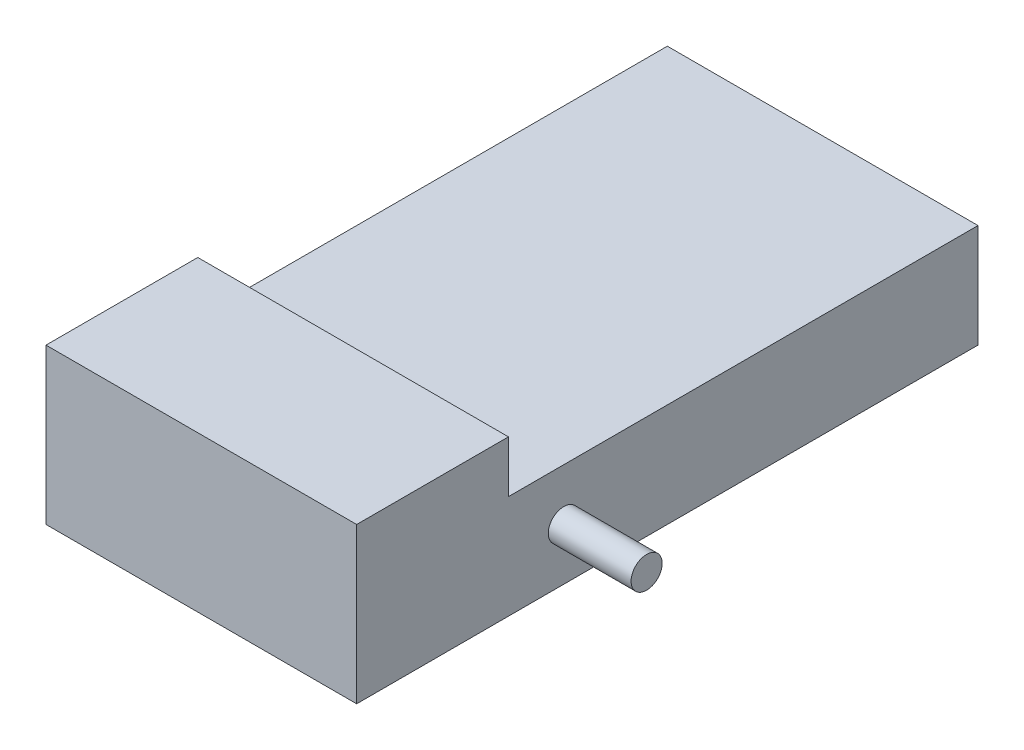
ISO-10303-21;
HEADER;
FILE_DESCRIPTION(('STEP AP214'),'2;1');
FILE_NAME('part.step','',(''),(''),'','','');
FILE_SCHEMA(('AUTOMOTIVE_DESIGN { 1 0 10303 214 1 1 1 1 }'));
ENDSEC;
DATA;
#1=APPLICATION_CONTEXT('core data for automotive mechanical design processes');
#2=APPLICATION_PROTOCOL_DEFINITION('international standard','automotive_design',2000,#1);
#3=PRODUCT_CONTEXT('',#1,'mechanical');
#4=PRODUCT('Part','Part','',(#3));
#5=PRODUCT_RELATED_PRODUCT_CATEGORY('part','',(#4));
#6=PRODUCT_DEFINITION_FORMATION('','',#4);
#7=PRODUCT_DEFINITION_CONTEXT('part definition',#1,'design');
#8=PRODUCT_DEFINITION('design','',#6,#7);
#9=PRODUCT_DEFINITION_SHAPE('','',#8);
#10=(LENGTH_UNIT() NAMED_UNIT(*) SI_UNIT(.MILLI.,.METRE.));
#11=(NAMED_UNIT(*) PLANE_ANGLE_UNIT() SI_UNIT($,.RADIAN.));
#12=(NAMED_UNIT(*) SI_UNIT($,.STERADIAN.) SOLID_ANGLE_UNIT());
#13=UNCERTAINTY_MEASURE_WITH_UNIT(LENGTH_MEASURE(1.E-05),#10,'distance_accuracy_value','');
#14=(GEOMETRIC_REPRESENTATION_CONTEXT(3) GLOBAL_UNCERTAINTY_ASSIGNED_CONTEXT((#13)) GLOBAL_UNIT_ASSIGNED_CONTEXT((#10,
#11,#12)) REPRESENTATION_CONTEXT('',''));
#15=CARTESIAN_POINT('',(0.,0.,0.));
#16=DIRECTION('',(0.,0.,1.));
#17=DIRECTION('',(1.,0.,0.));
#18=AXIS2_PLACEMENT_3D('',#15,#16,#17);
#19=CARTESIAN_POINT('',(0.,12.7,0.));
#20=DIRECTION('',(0.,-1.,0.));
#21=DIRECTION('',(0.,0.,-1.));
#22=AXIS2_PLACEMENT_3D('',#19,#20,#21);
#23=PLANE('',#22);
#24=DIRECTION('',(-1.,0.,0.));
#25=VECTOR('',#24,1.);
#26=CARTESIAN_POINT('',(38.1,12.7,-18.6146663541535));
#27=LINE('',#26,#25);
#28=CARTESIAN_POINT('',(38.1,12.7,-18.6146663541535));
#29=VERTEX_POINT('',#28);
#30=CARTESIAN_POINT('',(0.,12.7,-18.6146663541535));
#31=VERTEX_POINT('',#30);
#32=EDGE_CURVE('E48',#29,#31,#27,.T.);
#33=ORIENTED_EDGE('',*,*,#32,.F.);
#34=DIRECTION('',(0.,0.,-1.));
#35=VECTOR('',#34,1.);
#36=CARTESIAN_POINT('',(38.1,12.7,0.));
#37=LINE('',#36,#35);
#38=CARTESIAN_POINT('',(38.1,12.7,-76.2));
#39=VERTEX_POINT('',#38);
#40=EDGE_CURVE('E139',#29,#39,#37,.T.);
#41=ORIENTED_EDGE('',*,*,#40,.T.);
#42=DIRECTION('',(-1.,0.,0.));
#43=VECTOR('',#42,1.);
#44=CARTESIAN_POINT('',(0.,12.7,-76.2));
#45=LINE('',#44,#43);
#46=CARTESIAN_POINT('',(0.,12.7,-76.2));
#47=VERTEX_POINT('',#46);
#48=EDGE_CURVE('E54',#39,#47,#45,.T.);
#49=ORIENTED_EDGE('',*,*,#48,.T.);
#50=DIRECTION('',(0.,0.,1.));
#51=VECTOR('',#50,1.);
#52=CARTESIAN_POINT('',(0.,12.7,0.));
#53=LINE('',#52,#51);
#54=EDGE_CURVE('E83',#47,#31,#53,.T.);
#55=ORIENTED_EDGE('',*,*,#54,.T.);
#56=EDGE_LOOP('',(#33,#41,#49,#55));
#57=FACE_BOUND('',#56,.T.);
#58=ADVANCED_FACE('F33',(#57),#23,.F.);
#59=CARTESIAN_POINT('',(0.,12.7,0.));
#60=DIRECTION('',(1.,0.,0.));
#61=DIRECTION('',(0.,0.,-1.));
#62=AXIS2_PLACEMENT_3D('',#59,#60,#61);
#63=PLANE('',#62);
#64=DIRECTION('',(0.,0.,1.));
#65=VECTOR('',#64,1.);
#66=CARTESIAN_POINT('',(0.,0.,0.));
#67=LINE('',#66,#65);
#68=CARTESIAN_POINT('',(0.,0.,-76.2));
#69=VERTEX_POINT('',#68);
#70=CARTESIAN_POINT('',(0.,0.,0.));
#71=VERTEX_POINT('',#70);
#72=EDGE_CURVE('E89',#69,#71,#67,.T.);
#73=ORIENTED_EDGE('',*,*,#72,.T.);
#74=DIRECTION('',(0.,-1.,0.));
#75=VECTOR('',#74,1.);
#76=CARTESIAN_POINT('',(0.,12.7,0.));
#77=LINE('',#76,#75);
#78=CARTESIAN_POINT('',(0.,19.05,0.));
#79=VERTEX_POINT('',#78);
#80=EDGE_CURVE('E41',#79,#71,#77,.T.);
#81=ORIENTED_EDGE('',*,*,#80,.F.);
#82=DIRECTION('',(0.,0.,1.));
#83=VECTOR('',#82,1.);
#84=CARTESIAN_POINT('',(0.,19.05,-18.6146663541535));
#85=LINE('',#84,#83);
#86=CARTESIAN_POINT('',(0.,19.05,-18.6146663541535));
#87=VERTEX_POINT('',#86);
#88=EDGE_CURVE('E118',#87,#79,#85,.T.);
#89=ORIENTED_EDGE('',*,*,#88,.F.);
#90=DIRECTION('',(0.,-1.,0.));
#91=VECTOR('',#90,1.);
#92=CARTESIAN_POINT('',(0.,15.24,-18.6146663541535));
#93=LINE('',#92,#91);
#94=EDGE_CURVE('E99',#87,#31,#93,.T.);
#95=ORIENTED_EDGE('',*,*,#94,.T.);
#96=ORIENTED_EDGE('',*,*,#54,.F.);
#97=DIRECTION('',(0.,-1.,0.));
#98=VECTOR('',#97,1.);
#99=CARTESIAN_POINT('',(0.,12.7,-76.2));
#100=LINE('',#99,#98);
#101=EDGE_CURVE('E76',#47,#69,#100,.T.);
#102=ORIENTED_EDGE('',*,*,#101,.T.);
#103=EDGE_LOOP('',(#73,#81,#89,#95,#96,#102));
#104=FACE_BOUND('',#103,.T.);
#105=ADVANCED_FACE('F35',(#104),#63,.F.);
#106=CARTESIAN_POINT('',(0.,12.7,0.));
#107=DIRECTION('',(0.,0.,-1.));
#108=DIRECTION('',(-1.,0.,0.));
#109=AXIS2_PLACEMENT_3D('',#106,#107,#108);
#110=PLANE('',#109);
#111=DIRECTION('',(1.,0.,0.));
#112=VECTOR('',#111,1.);
#113=CARTESIAN_POINT('',(0.,0.,0.));
#114=LINE('',#113,#112);
#115=CARTESIAN_POINT('',(38.1,0.,0.));
#116=VERTEX_POINT('',#115);
#117=EDGE_CURVE('E93',#71,#116,#114,.T.);
#118=ORIENTED_EDGE('',*,*,#117,.T.);
#119=DIRECTION('',(0.,-1.,0.));
#120=VECTOR('',#119,1.);
#121=CARTESIAN_POINT('',(38.1,12.7,0.));
#122=LINE('',#121,#120);
#123=CARTESIAN_POINT('',(38.1,19.05,0.));
#124=VERTEX_POINT('',#123);
#125=EDGE_CURVE('E106',#124,#116,#122,.T.);
#126=ORIENTED_EDGE('',*,*,#125,.F.);
#127=DIRECTION('',(1.,0.,0.));
#128=VECTOR('',#127,1.);
#129=CARTESIAN_POINT('',(38.1,19.05,0.));
#130=LINE('',#129,#128);
#131=EDGE_CURVE('E114',#79,#124,#130,.T.);
#132=ORIENTED_EDGE('',*,*,#131,.F.);
#133=ORIENTED_EDGE('',*,*,#80,.T.);
#134=EDGE_LOOP('',(#118,#126,#132,#133));
#135=FACE_BOUND('',#134,.T.);
#136=ADVANCED_FACE('F110',(#135),#110,.F.);
#137=CARTESIAN_POINT('',(38.1,12.7,0.));
#138=DIRECTION('',(-1.,0.,0.));
#139=DIRECTION('',(0.,0.,1.));
#140=AXIS2_PLACEMENT_3D('',#137,#138,#139);
#141=PLANE('',#140);
#142=CARTESIAN_POINT('',(38.1,6.35,-25.4));
#143=DIRECTION('',(-1.,0.,0.));
#144=DIRECTION('',(0.,0.,1.));
#145=AXIS2_PLACEMENT_3D('',#142,#143,#144);
#146=CIRCLE('',#145,1.905);
#147=CARTESIAN_POINT('',(38.1,6.35,-23.495));
#148=VERTEX_POINT('',#147);
#149=EDGE_CURVE('E11',#148,#148,#146,.F.);
#150=ORIENTED_EDGE('',*,*,#149,.F.);
#151=EDGE_LOOP('',(#150));
#152=FACE_BOUND('',#151,.T.);
#153=DIRECTION('',(0.,0.,-1.));
#154=VECTOR('',#153,1.);
#155=CARTESIAN_POINT('',(38.1,0.,0.));
#156=LINE('',#155,#154);
#157=CARTESIAN_POINT('',(38.1,0.,-76.2));
#158=VERTEX_POINT('',#157);
#159=EDGE_CURVE('E84',#116,#158,#156,.T.);
#160=ORIENTED_EDGE('',*,*,#159,.T.);
#161=DIRECTION('',(0.,-1.,0.));
#162=VECTOR('',#161,1.);
#163=CARTESIAN_POINT('',(38.1,12.7,-76.2));
#164=LINE('',#163,#162);
#165=EDGE_CURVE('E79',#39,#158,#164,.T.);
#166=ORIENTED_EDGE('',*,*,#165,.F.);
#167=ORIENTED_EDGE('',*,*,#40,.F.);
#168=DIRECTION('',(0.,-1.,0.));
#169=VECTOR('',#168,1.);
#170=CARTESIAN_POINT('',(38.1,15.24,-18.6146663541535));
#171=LINE('',#170,#169);
#172=CARTESIAN_POINT('',(38.1,19.05,-18.6146663541535));
#173=VERTEX_POINT('',#172);
#174=EDGE_CURVE('E95',#173,#29,#171,.T.);
#175=ORIENTED_EDGE('',*,*,#174,.F.);
#176=DIRECTION('',(0.,0.,-1.));
#177=VECTOR('',#176,1.);
#178=CARTESIAN_POINT('',(38.1,19.05,-18.6146663541535));
#179=LINE('',#178,#177);
#180=EDGE_CURVE('E131',#124,#173,#179,.T.);
#181=ORIENTED_EDGE('',*,*,#180,.F.);
#182=ORIENTED_EDGE('',*,*,#125,.T.);
#183=EDGE_LOOP('',(#160,#166,#167,#175,#181,#182));
#184=FACE_BOUND('',#183,.T.);
#185=ADVANCED_FACE('F142',(#152,#184),#141,.F.);
#186=CARTESIAN_POINT('',(0.,12.7,-76.2));
#187=DIRECTION('',(0.,0.,1.));
#188=DIRECTION('',(1.,0.,0.));
#189=AXIS2_PLACEMENT_3D('',#186,#187,#188);
#190=PLANE('',#189);
#191=DIRECTION('',(-1.,0.,0.));
#192=VECTOR('',#191,1.);
#193=CARTESIAN_POINT('',(0.,0.,-76.2));
#194=LINE('',#193,#192);
#195=EDGE_CURVE('E73',#158,#69,#194,.T.);
#196=ORIENTED_EDGE('',*,*,#195,.T.);
#197=ORIENTED_EDGE('',*,*,#101,.F.);
#198=ORIENTED_EDGE('',*,*,#48,.F.);
#199=ORIENTED_EDGE('',*,*,#165,.T.);
#200=EDGE_LOOP('',(#196,#197,#198,#199));
#201=FACE_BOUND('',#200,.T.);
#202=ADVANCED_FACE('F75',(#201),#190,.F.);
#203=CARTESIAN_POINT('',(0.,0.,0.));
#204=DIRECTION('',(0.,-1.,0.));
#205=DIRECTION('',(0.,0.,-1.));
#206=AXIS2_PLACEMENT_3D('',#203,#204,#205);
#207=PLANE('',#206);
#208=ORIENTED_EDGE('',*,*,#72,.F.);
#209=ORIENTED_EDGE('',*,*,#195,.F.);
#210=ORIENTED_EDGE('',*,*,#159,.F.);
#211=ORIENTED_EDGE('',*,*,#117,.F.);
#212=EDGE_LOOP('',(#208,#209,#210,#211));
#213=FACE_BOUND('',#212,.T.);
#214=ADVANCED_FACE('F92',(#213),#207,.T.);
#215=CARTESIAN_POINT('',(38.1,15.24,-18.6146663541535));
#216=DIRECTION('',(0.,0.,1.));
#217=DIRECTION('',(1.,0.,0.));
#218=AXIS2_PLACEMENT_3D('',#215,#216,#217);
#219=PLANE('',#218);
#220=ORIENTED_EDGE('',*,*,#32,.T.);
#221=ORIENTED_EDGE('',*,*,#94,.F.);
#222=DIRECTION('',(-1.,0.,0.));
#223=VECTOR('',#222,1.);
#224=CARTESIAN_POINT('',(38.1,19.05,-18.6146663541535));
#225=LINE('',#224,#223);
#226=EDGE_CURVE('E127',#173,#87,#225,.T.);
#227=ORIENTED_EDGE('',*,*,#226,.F.);
#228=ORIENTED_EDGE('',*,*,#174,.T.);
#229=EDGE_LOOP('',(#220,#221,#227,#228));
#230=FACE_BOUND('',#229,.T.);
#231=ADVANCED_FACE('F149',(#230),#219,.F.);
#232=CARTESIAN_POINT('',(48.26,6.35,-25.4));
#233=DIRECTION('',(-1.,0.,0.));
#234=DIRECTION('',(0.,0.,1.));
#235=AXIS2_PLACEMENT_3D('',#232,#233,#234);
#236=CYLINDRICAL_SURFACE('',#235,1.905);
#237=CARTESIAN_POINT('',(48.26,6.35,-25.4));
#238=DIRECTION('',(1.,0.,0.));
#239=DIRECTION('',(0.,0.,-1.));
#240=AXIS2_PLACEMENT_3D('',#237,#238,#239);
#241=CIRCLE('',#240,1.905);
#242=CARTESIAN_POINT('',(48.26,6.35,-27.305));
#243=VERTEX_POINT('',#242);
#244=EDGE_CURVE('E129',#243,#243,#241,.T.);
#245=ORIENTED_EDGE('',*,*,#244,.F.);
#246=EDGE_LOOP('',(#245));
#247=FACE_BOUND('',#246,.T.);
#248=ORIENTED_EDGE('',*,*,#149,.T.);
#249=EDGE_LOOP('',(#248));
#250=FACE_BOUND('',#249,.T.);
#251=ADVANCED_FACE('F151',(#247,#250),#236,.T.);
#252=CARTESIAN_POINT('',(48.26,6.35,-25.4));
#253=DIRECTION('',(1.,0.,0.));
#254=DIRECTION('',(0.,0.,-1.));
#255=AXIS2_PLACEMENT_3D('',#252,#253,#254);
#256=PLANE('',#255);
#257=ORIENTED_EDGE('',*,*,#244,.T.);
#258=EDGE_LOOP('',(#257));
#259=FACE_BOUND('',#258,.T.);
#260=ADVANCED_FACE('F157',(#259),#256,.T.);
#261=CARTESIAN_POINT('',(0.,19.05,0.));
#262=DIRECTION('',(0.,-1.,0.));
#263=DIRECTION('',(0.,0.,-1.));
#264=AXIS2_PLACEMENT_3D('',#261,#262,#263);
#265=PLANE('',#264);
#266=ORIENTED_EDGE('',*,*,#180,.T.);
#267=ORIENTED_EDGE('',*,*,#226,.T.);
#268=ORIENTED_EDGE('',*,*,#88,.T.);
#269=ORIENTED_EDGE('',*,*,#131,.T.);
#270=EDGE_LOOP('',(#266,#267,#268,#269));
#271=FACE_BOUND('',#270,.T.);
#272=ADVANCED_FACE('F124',(#271),#265,.F.);
#273=CLOSED_SHELL('',(#58,#105,#136,#185,#202,#214,#231,#251,#260,#272));
#274=MANIFOLD_SOLID_BREP('B2',#273);
#275=ADVANCED_BREP_SHAPE_REPRESENTATION('',(#18,#274),#14);
#276=SHAPE_DEFINITION_REPRESENTATION(#9,#275);
ENDSEC;
END-ISO-10303-21;
